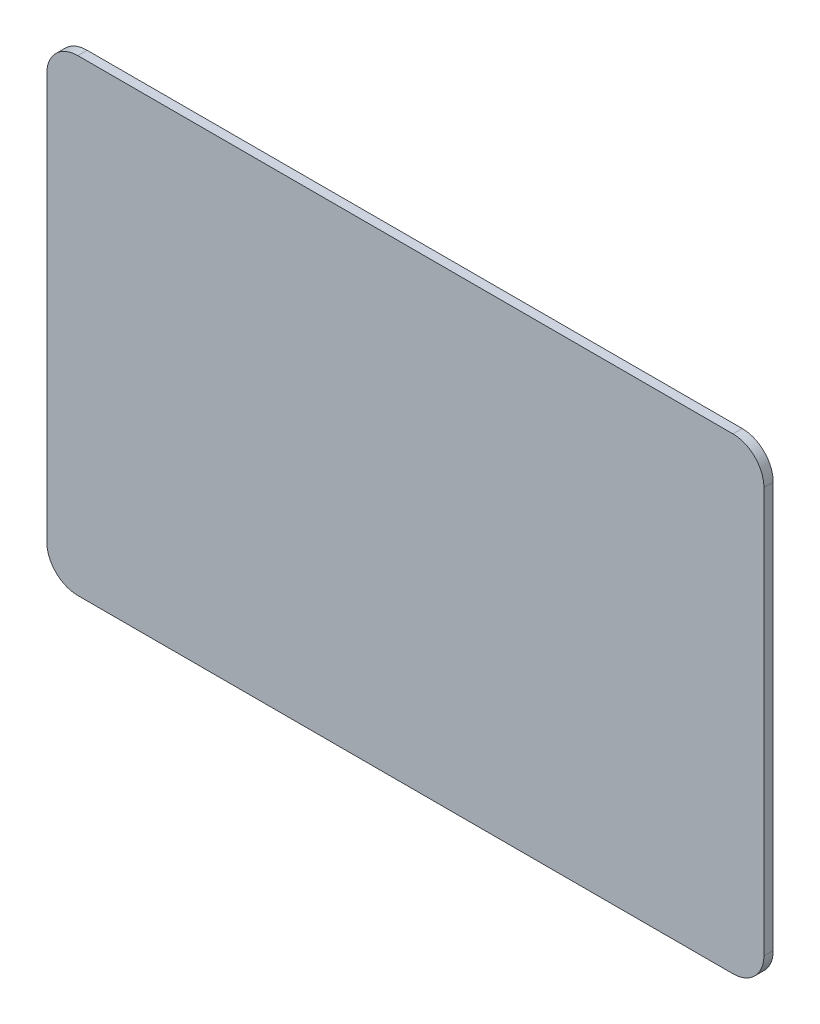
ISO-10303-21;
HEADER;
FILE_DESCRIPTION(('STEP AP214'),'2;1');
FILE_NAME('part.step','',(''),(''),'','','');
FILE_SCHEMA(('AUTOMOTIVE_DESIGN { 1 0 10303 214 1 1 1 1 }'));
ENDSEC;
DATA;
#1=APPLICATION_CONTEXT('core data for automotive mechanical design processes');
#2=APPLICATION_PROTOCOL_DEFINITION('international standard','automotive_design',2000,#1);
#3=PRODUCT_CONTEXT('',#1,'mechanical');
#4=PRODUCT('Part','Part','',(#3));
#5=PRODUCT_RELATED_PRODUCT_CATEGORY('part','',(#4));
#6=PRODUCT_DEFINITION_FORMATION('','',#4);
#7=PRODUCT_DEFINITION_CONTEXT('part definition',#1,'design');
#8=PRODUCT_DEFINITION('design','',#6,#7);
#9=PRODUCT_DEFINITION_SHAPE('','',#8);
#10=(LENGTH_UNIT() NAMED_UNIT(*) SI_UNIT(.MILLI.,.METRE.));
#11=(NAMED_UNIT(*) PLANE_ANGLE_UNIT() SI_UNIT($,.RADIAN.));
#12=(NAMED_UNIT(*) SI_UNIT($,.STERADIAN.) SOLID_ANGLE_UNIT());
#13=UNCERTAINTY_MEASURE_WITH_UNIT(LENGTH_MEASURE(1.E-05),#10,'distance_accuracy_value','');
#14=(GEOMETRIC_REPRESENTATION_CONTEXT(3) GLOBAL_UNCERTAINTY_ASSIGNED_CONTEXT((#13)) GLOBAL_UNIT_ASSIGNED_CONTEXT((#10,
#11,#12)) REPRESENTATION_CONTEXT('',''));
#15=CARTESIAN_POINT('',(0.,0.,0.));
#16=DIRECTION('',(0.,0.,1.));
#17=DIRECTION('',(1.,0.,0.));
#18=AXIS2_PLACEMENT_3D('',#15,#16,#17);
#19=CARTESIAN_POINT('',(52.88,-32.74,1.5));
#20=DIRECTION('',(0.,0.,-1.));
#21=DIRECTION('',(-1.,0.,0.));
#22=AXIS2_PLACEMENT_3D('',#19,#20,#21);
#23=CYLINDRICAL_SURFACE('',#22,5.);
#24=CARTESIAN_POINT('',(52.88,-32.74,0.));
#25=DIRECTION('',(0.,0.,1.));
#26=DIRECTION('',(1.,0.,0.));
#27=AXIS2_PLACEMENT_3D('',#24,#25,#26);
#28=CIRCLE('',#27,5.);
#29=CARTESIAN_POINT('',(52.88,-37.74,0.));
#30=VERTEX_POINT('',#29);
#31=CARTESIAN_POINT('',(57.88,-32.74,0.));
#32=VERTEX_POINT('',#31);
#33=EDGE_CURVE('E144',#30,#32,#28,.T.);
#34=ORIENTED_EDGE('',*,*,#33,.T.);
#35=DIRECTION('',(0.,0.,-1.));
#36=VECTOR('',#35,1.);
#37=CARTESIAN_POINT('',(57.88,-32.74,1.5));
#38=LINE('',#37,#36);
#39=CARTESIAN_POINT('',(57.88,-32.74,1.5));
#40=VERTEX_POINT('',#39);
#41=EDGE_CURVE('E11',#40,#32,#38,.T.);
#42=ORIENTED_EDGE('',*,*,#41,.F.);
#43=CARTESIAN_POINT('',(52.88,-32.74,1.5));
#44=DIRECTION('',(0.,0.,1.));
#45=DIRECTION('',(1.,0.,0.));
#46=AXIS2_PLACEMENT_3D('',#43,#44,#45);
#47=CIRCLE('',#46,5.);
#48=CARTESIAN_POINT('',(52.88,-37.74,1.5));
#49=VERTEX_POINT('',#48);
#50=EDGE_CURVE('E166',#49,#40,#47,.T.);
#51=ORIENTED_EDGE('',*,*,#50,.F.);
#52=DIRECTION('',(0.,0.,-1.));
#53=VECTOR('',#52,1.);
#54=CARTESIAN_POINT('',(52.88,-37.74,1.5));
#55=LINE('',#54,#53);
#56=EDGE_CURVE('E140',#49,#30,#55,.T.);
#57=ORIENTED_EDGE('',*,*,#56,.T.);
#58=EDGE_LOOP('',(#34,#42,#51,#57));
#59=FACE_BOUND('',#58,.T.);
#60=ADVANCED_FACE('F43',(#59),#23,.T.);
#61=CARTESIAN_POINT('',(57.88,32.74,1.5));
#62=DIRECTION('',(-1.,0.,0.));
#63=DIRECTION('',(0.,-1.,0.));
#64=AXIS2_PLACEMENT_3D('',#61,#62,#63);
#65=PLANE('',#64);
#66=DIRECTION('',(0.,1.,0.));
#67=VECTOR('',#66,1.);
#68=CARTESIAN_POINT('',(57.88,32.74,0.));
#69=LINE('',#68,#67);
#70=CARTESIAN_POINT('',(57.88,32.74,0.));
#71=VERTEX_POINT('',#70);
#72=EDGE_CURVE('E148',#32,#71,#69,.T.);
#73=ORIENTED_EDGE('',*,*,#72,.T.);
#74=DIRECTION('',(0.,0.,-1.));
#75=VECTOR('',#74,1.);
#76=CARTESIAN_POINT('',(57.88,32.74,1.5));
#77=LINE('',#76,#75);
#78=CARTESIAN_POINT('',(57.88,32.74,1.5));
#79=VERTEX_POINT('',#78);
#80=EDGE_CURVE('E52',#79,#71,#77,.T.);
#81=ORIENTED_EDGE('',*,*,#80,.F.);
#82=DIRECTION('',(0.,1.,0.));
#83=VECTOR('',#82,1.);
#84=CARTESIAN_POINT('',(57.88,32.74,1.5));
#85=LINE('',#84,#83);
#86=EDGE_CURVE('E103',#40,#79,#85,.T.);
#87=ORIENTED_EDGE('',*,*,#86,.F.);
#88=ORIENTED_EDGE('',*,*,#41,.T.);
#89=EDGE_LOOP('',(#73,#81,#87,#88));
#90=FACE_BOUND('',#89,.T.);
#91=ADVANCED_FACE('F212',(#90),#65,.F.);
#92=CARTESIAN_POINT('',(52.88,32.74,1.5));
#93=DIRECTION('',(0.,0.,-1.));
#94=DIRECTION('',(-1.,0.,0.));
#95=AXIS2_PLACEMENT_3D('',#92,#93,#94);
#96=CYLINDRICAL_SURFACE('',#95,5.);
#97=CARTESIAN_POINT('',(52.88,32.74,0.));
#98=DIRECTION('',(0.,0.,1.));
#99=DIRECTION('',(-1.,0.,0.));
#100=AXIS2_PLACEMENT_3D('',#97,#98,#99);
#101=CIRCLE('',#100,5.);
#102=CARTESIAN_POINT('',(52.8799999999999,37.74,0.));
#103=VERTEX_POINT('',#102);
#104=EDGE_CURVE('E151',#71,#103,#101,.T.);
#105=ORIENTED_EDGE('',*,*,#104,.T.);
#106=DIRECTION('',(0.,0.,-1.));
#107=VECTOR('',#106,1.);
#108=CARTESIAN_POINT('',(52.8799999999999,37.74,1.5));
#109=LINE('',#108,#107);
#110=CARTESIAN_POINT('',(52.8799999999999,37.74,1.5));
#111=VERTEX_POINT('',#110);
#112=EDGE_CURVE('E177',#111,#103,#109,.T.);
#113=ORIENTED_EDGE('',*,*,#112,.F.);
#114=CARTESIAN_POINT('',(52.88,32.74,1.5));
#115=DIRECTION('',(0.,0.,1.));
#116=DIRECTION('',(-1.,0.,0.));
#117=AXIS2_PLACEMENT_3D('',#114,#115,#116);
#118=CIRCLE('',#117,5.);
#119=EDGE_CURVE('E187',#79,#111,#118,.T.);
#120=ORIENTED_EDGE('',*,*,#119,.F.);
#121=ORIENTED_EDGE('',*,*,#80,.T.);
#122=EDGE_LOOP('',(#105,#113,#120,#121));
#123=FACE_BOUND('',#122,.T.);
#124=ADVANCED_FACE('F185',(#123),#96,.T.);
#125=CARTESIAN_POINT('',(-52.88,37.74,1.5));
#126=DIRECTION('',(0.,-1.,0.));
#127=DIRECTION('',(0.,0.,-1.));
#128=AXIS2_PLACEMENT_3D('',#125,#126,#127);
#129=PLANE('',#128);
#130=DIRECTION('',(-1.,0.,0.));
#131=VECTOR('',#130,1.);
#132=CARTESIAN_POINT('',(-52.88,37.74,0.));
#133=LINE('',#132,#131);
#134=CARTESIAN_POINT('',(-52.88,37.74,0.));
#135=VERTEX_POINT('',#134);
#136=EDGE_CURVE('E154',#103,#135,#133,.T.);
#137=ORIENTED_EDGE('',*,*,#136,.T.);
#138=DIRECTION('',(0.,0.,-1.));
#139=VECTOR('',#138,1.);
#140=CARTESIAN_POINT('',(-52.88,37.74,1.5));
#141=LINE('',#140,#139);
#142=CARTESIAN_POINT('',(-52.88,37.74,1.5));
#143=VERTEX_POINT('',#142);
#144=EDGE_CURVE('E173',#143,#135,#141,.T.);
#145=ORIENTED_EDGE('',*,*,#144,.F.);
#146=DIRECTION('',(-1.,0.,0.));
#147=VECTOR('',#146,1.);
#148=CARTESIAN_POINT('',(-52.88,37.74,1.5));
#149=LINE('',#148,#147);
#150=EDGE_CURVE('E200',#111,#143,#149,.T.);
#151=ORIENTED_EDGE('',*,*,#150,.F.);
#152=ORIENTED_EDGE('',*,*,#112,.T.);
#153=EDGE_LOOP('',(#137,#145,#151,#152));
#154=FACE_BOUND('',#153,.T.);
#155=ADVANCED_FACE('F195',(#154),#129,.F.);
#156=CARTESIAN_POINT('',(-52.88,32.74,1.5));
#157=DIRECTION('',(0.,0.,-1.));
#158=DIRECTION('',(-1.,0.,0.));
#159=AXIS2_PLACEMENT_3D('',#156,#157,#158);
#160=CYLINDRICAL_SURFACE('',#159,5.);
#161=CARTESIAN_POINT('',(-52.88,32.74,0.));
#162=DIRECTION('',(0.,0.,1.));
#163=DIRECTION('',(1.,0.,0.));
#164=AXIS2_PLACEMENT_3D('',#161,#162,#163);
#165=CIRCLE('',#164,5.);
#166=CARTESIAN_POINT('',(-57.88,32.74,0.));
#167=VERTEX_POINT('',#166);
#168=EDGE_CURVE('E157',#135,#167,#165,.T.);
#169=ORIENTED_EDGE('',*,*,#168,.T.);
#170=DIRECTION('',(0.,0.,-1.));
#171=VECTOR('',#170,1.);
#172=CARTESIAN_POINT('',(-57.88,32.74,1.5));
#173=LINE('',#172,#171);
#174=CARTESIAN_POINT('',(-57.88,32.74,1.5));
#175=VERTEX_POINT('',#174);
#176=EDGE_CURVE('E133',#175,#167,#173,.T.);
#177=ORIENTED_EDGE('',*,*,#176,.F.);
#178=CARTESIAN_POINT('',(-52.88,32.74,1.5));
#179=DIRECTION('',(0.,0.,1.));
#180=DIRECTION('',(1.,0.,0.));
#181=AXIS2_PLACEMENT_3D('',#178,#179,#180);
#182=CIRCLE('',#181,5.);
#183=EDGE_CURVE('E122',#143,#175,#182,.T.);
#184=ORIENTED_EDGE('',*,*,#183,.F.);
#185=ORIENTED_EDGE('',*,*,#144,.T.);
#186=EDGE_LOOP('',(#169,#177,#184,#185));
#187=FACE_BOUND('',#186,.T.);
#188=ADVANCED_FACE('F198',(#187),#160,.T.);
#189=CARTESIAN_POINT('',(-57.88,32.74,1.5));
#190=DIRECTION('',(1.,0.,0.));
#191=DIRECTION('',(0.,1.,0.));
#192=AXIS2_PLACEMENT_3D('',#189,#190,#191);
#193=PLANE('',#192);
#194=DIRECTION('',(0.,-1.,0.));
#195=VECTOR('',#194,1.);
#196=CARTESIAN_POINT('',(-57.88,32.74,0.));
#197=LINE('',#196,#195);
#198=CARTESIAN_POINT('',(-57.88,-32.74,0.));
#199=VERTEX_POINT('',#198);
#200=EDGE_CURVE('E131',#167,#199,#197,.T.);
#201=ORIENTED_EDGE('',*,*,#200,.T.);
#202=DIRECTION('',(0.,0.,-1.));
#203=VECTOR('',#202,1.);
#204=CARTESIAN_POINT('',(-57.88,-32.74,1.5));
#205=LINE('',#204,#203);
#206=CARTESIAN_POINT('',(-57.88,-32.74,1.5));
#207=VERTEX_POINT('',#206);
#208=EDGE_CURVE('E128',#207,#199,#205,.T.);
#209=ORIENTED_EDGE('',*,*,#208,.F.);
#210=DIRECTION('',(0.,-1.,0.));
#211=VECTOR('',#210,1.);
#212=CARTESIAN_POINT('',(-57.88,32.74,1.5));
#213=LINE('',#212,#211);
#214=EDGE_CURVE('E116',#175,#207,#213,.T.);
#215=ORIENTED_EDGE('',*,*,#214,.F.);
#216=ORIENTED_EDGE('',*,*,#176,.T.);
#217=EDGE_LOOP('',(#201,#209,#215,#216));
#218=FACE_BOUND('',#217,.T.);
#219=ADVANCED_FACE('F129',(#218),#193,.F.);
#220=CARTESIAN_POINT('',(-52.88,-32.74,1.5));
#221=DIRECTION('',(0.,0.,-1.));
#222=DIRECTION('',(-1.,0.,0.));
#223=AXIS2_PLACEMENT_3D('',#220,#221,#222);
#224=CYLINDRICAL_SURFACE('',#223,5.);
#225=CARTESIAN_POINT('',(-52.88,-32.74,0.));
#226=DIRECTION('',(0.,0.,1.));
#227=DIRECTION('',(1.,0.,0.));
#228=AXIS2_PLACEMENT_3D('',#225,#226,#227);
#229=CIRCLE('',#228,5.);
#230=CARTESIAN_POINT('',(-52.88,-37.74,0.));
#231=VERTEX_POINT('',#230);
#232=EDGE_CURVE('E89',#199,#231,#229,.T.);
#233=ORIENTED_EDGE('',*,*,#232,.T.);
#234=DIRECTION('',(0.,0.,-1.));
#235=VECTOR('',#234,1.);
#236=CARTESIAN_POINT('',(-52.88,-37.74,1.5));
#237=LINE('',#236,#235);
#238=CARTESIAN_POINT('',(-52.88,-37.74,1.5));
#239=VERTEX_POINT('',#238);
#240=EDGE_CURVE('E134',#239,#231,#237,.T.);
#241=ORIENTED_EDGE('',*,*,#240,.F.);
#242=CARTESIAN_POINT('',(-52.88,-32.74,1.5));
#243=DIRECTION('',(0.,0.,1.));
#244=DIRECTION('',(1.,0.,0.));
#245=AXIS2_PLACEMENT_3D('',#242,#243,#244);
#246=CIRCLE('',#245,5.);
#247=EDGE_CURVE('E120',#207,#239,#246,.T.);
#248=ORIENTED_EDGE('',*,*,#247,.F.);
#249=ORIENTED_EDGE('',*,*,#208,.T.);
#250=EDGE_LOOP('',(#233,#241,#248,#249));
#251=FACE_BOUND('',#250,.T.);
#252=ADVANCED_FACE('F136',(#251),#224,.T.);
#253=CARTESIAN_POINT('',(-52.88,-37.74,1.5));
#254=DIRECTION('',(0.,1.,0.));
#255=DIRECTION('',(0.,0.,1.));
#256=AXIS2_PLACEMENT_3D('',#253,#254,#255);
#257=PLANE('',#256);
#258=DIRECTION('',(1.,0.,0.));
#259=VECTOR('',#258,1.);
#260=CARTESIAN_POINT('',(-52.88,-37.74,0.));
#261=LINE('',#260,#259);
#262=EDGE_CURVE('E95',#231,#30,#261,.T.);
#263=ORIENTED_EDGE('',*,*,#262,.T.);
#264=ORIENTED_EDGE('',*,*,#56,.F.);
#265=DIRECTION('',(1.,0.,0.));
#266=VECTOR('',#265,1.);
#267=CARTESIAN_POINT('',(-52.88,-37.74,1.5));
#268=LINE('',#267,#266);
#269=EDGE_CURVE('E60',#239,#49,#268,.T.);
#270=ORIENTED_EDGE('',*,*,#269,.F.);
#271=ORIENTED_EDGE('',*,*,#240,.T.);
#272=EDGE_LOOP('',(#263,#264,#270,#271));
#273=FACE_BOUND('',#272,.T.);
#274=ADVANCED_FACE('F228',(#273),#257,.F.);
#275=CARTESIAN_POINT('',(52.88,-32.74,1.5));
#276=DIRECTION('',(0.,0.,1.));
#277=DIRECTION('',(1.,0.,0.));
#278=AXIS2_PLACEMENT_3D('',#275,#276,#277);
#279=PLANE('',#278);
#280=ORIENTED_EDGE('',*,*,#50,.T.);
#281=ORIENTED_EDGE('',*,*,#86,.T.);
#282=ORIENTED_EDGE('',*,*,#119,.T.);
#283=ORIENTED_EDGE('',*,*,#150,.T.);
#284=ORIENTED_EDGE('',*,*,#183,.T.);
#285=ORIENTED_EDGE('',*,*,#214,.T.);
#286=ORIENTED_EDGE('',*,*,#247,.T.);
#287=ORIENTED_EDGE('',*,*,#269,.T.);
#288=EDGE_LOOP('',(#280,#281,#282,#283,#284,#285,#286,#287));
#289=FACE_BOUND('',#288,.T.);
#290=ADVANCED_FACE('F118',(#289),#279,.T.);
#291=CARTESIAN_POINT('',(52.88,-32.74,0.));
#292=DIRECTION('',(0.,0.,1.));
#293=DIRECTION('',(1.,0.,0.));
#294=AXIS2_PLACEMENT_3D('',#291,#292,#293);
#295=PLANE('',#294);
#296=ORIENTED_EDGE('',*,*,#33,.F.);
#297=ORIENTED_EDGE('',*,*,#262,.F.);
#298=ORIENTED_EDGE('',*,*,#232,.F.);
#299=ORIENTED_EDGE('',*,*,#200,.F.);
#300=ORIENTED_EDGE('',*,*,#168,.F.);
#301=ORIENTED_EDGE('',*,*,#136,.F.);
#302=ORIENTED_EDGE('',*,*,#104,.F.);
#303=ORIENTED_EDGE('',*,*,#72,.F.);
#304=EDGE_LOOP('',(#296,#297,#298,#299,#300,#301,#302,#303));
#305=FACE_BOUND('',#304,.T.);
#306=ADVANCED_FACE('F191',(#305),#295,.F.);
#307=CLOSED_SHELL('',(#60,#91,#124,#155,#188,#219,#252,#274,#290,#306));
#308=MANIFOLD_SOLID_BREP('B2',#307);
#309=ADVANCED_BREP_SHAPE_REPRESENTATION('',(#18,#308),#14);
#310=SHAPE_DEFINITION_REPRESENTATION(#9,#309);
ENDSEC;
END-ISO-10303-21;
